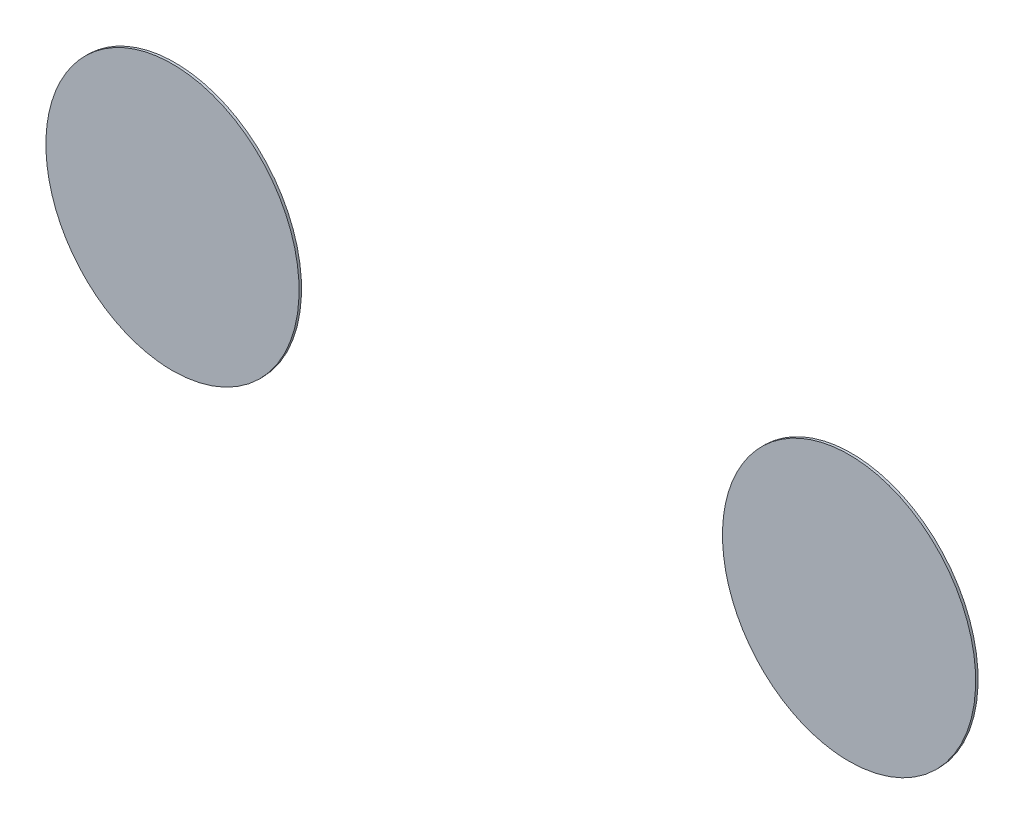
ISO-10303-21;
HEADER;
FILE_DESCRIPTION(('STEP AP214'),'2;1');
FILE_NAME('part.step','',(''),(''),'','','');
FILE_SCHEMA(('AUTOMOTIVE_DESIGN { 1 0 10303 214 1 1 1 1 }'));
ENDSEC;
DATA;
#1=APPLICATION_CONTEXT('core data for automotive mechanical design processes');
#2=APPLICATION_PROTOCOL_DEFINITION('international standard','automotive_design',2000,#1);
#3=PRODUCT_CONTEXT('',#1,'mechanical');
#4=PRODUCT('Part','Part','',(#3));
#5=PRODUCT_RELATED_PRODUCT_CATEGORY('part','',(#4));
#6=PRODUCT_DEFINITION_FORMATION('','',#4);
#7=PRODUCT_DEFINITION_CONTEXT('part definition',#1,'design');
#8=PRODUCT_DEFINITION('design','',#6,#7);
#9=PRODUCT_DEFINITION_SHAPE('','',#8);
#10=(LENGTH_UNIT() NAMED_UNIT(*) SI_UNIT(.MILLI.,.METRE.));
#11=(NAMED_UNIT(*) PLANE_ANGLE_UNIT() SI_UNIT($,.RADIAN.));
#12=(NAMED_UNIT(*) SI_UNIT($,.STERADIAN.) SOLID_ANGLE_UNIT());
#13=UNCERTAINTY_MEASURE_WITH_UNIT(LENGTH_MEASURE(1.E-05),#10,'distance_accuracy_value','');
#14=(GEOMETRIC_REPRESENTATION_CONTEXT(3) GLOBAL_UNCERTAINTY_ASSIGNED_CONTEXT((#13)) GLOBAL_UNIT_ASSIGNED_CONTEXT((#10,
#11,#12)) REPRESENTATION_CONTEXT('',''));
#15=CARTESIAN_POINT('',(0.,0.,0.));
#16=DIRECTION('',(0.,0.,1.));
#17=DIRECTION('',(1.,0.,0.));
#18=AXIS2_PLACEMENT_3D('',#15,#16,#17);
#19=CARTESIAN_POINT('',(27.7774482326432,131.984792082023,0.2));
#20=DIRECTION('',(0.,0.,1.));
#21=DIRECTION('',(0.,-1.,0.));
#22=AXIS2_PLACEMENT_3D('',#19,#20,#21);
#23=ELLIPSE('',#22,10.9064827416671,10.3952413631364);
#24=DIRECTION('',(0.,0.,-1.));
#25=VECTOR('',#24,1.);
#26=SURFACE_OF_LINEAR_EXTRUSION('',#23,#25);
#27=CARTESIAN_POINT('',(27.7774482326432,121.078309340356,0.2));
#28=VERTEX_POINT('',#27);
#29=EDGE_CURVE('E11',#28,#28,#23,.T.);
#30=ORIENTED_EDGE('',*,*,#29,.F.);
#31=EDGE_LOOP('',(#30));
#32=FACE_BOUND('',#31,.T.);
#33=CARTESIAN_POINT('',(27.7774482326432,131.984792082023,0.));
#34=DIRECTION('',(0.,0.,1.));
#35=DIRECTION('',(0.,-1.,0.));
#36=AXIS2_PLACEMENT_3D('',#33,#34,#35);
#37=ELLIPSE('',#36,10.9064827416671,10.3952413631364);
#38=CARTESIAN_POINT('',(27.7774482326432,121.078309340356,0.));
#39=VERTEX_POINT('',#38);
#40=EDGE_CURVE('E43',#39,#39,#37,.T.);
#41=ORIENTED_EDGE('',*,*,#40,.T.);
#42=EDGE_LOOP('',(#41));
#43=FACE_BOUND('',#42,.T.);
#44=ADVANCED_FACE('F39',(#32,#43),#26,.F.);
#45=CARTESIAN_POINT('',(27.7774482326432,131.984792082023,0.2));
#46=DIRECTION('',(0.,0.,1.));
#47=DIRECTION('',(1.,0.,0.));
#48=AXIS2_PLACEMENT_3D('',#45,#46,#47);
#49=PLANE('',#48);
#50=ORIENTED_EDGE('',*,*,#29,.T.);
#51=EDGE_LOOP('',(#50));
#52=FACE_BOUND('',#51,.T.);
#53=ADVANCED_FACE('F55',(#52),#49,.T.);
#54=CARTESIAN_POINT('',(27.7774482326432,131.984792082023,0.));
#55=DIRECTION('',(0.,0.,1.));
#56=DIRECTION('',(1.,0.,0.));
#57=AXIS2_PLACEMENT_3D('',#54,#55,#56);
#58=PLANE('',#57);
#59=ORIENTED_EDGE('',*,*,#40,.F.);
#60=EDGE_LOOP('',(#59));
#61=FACE_BOUND('',#60,.T.);
#62=ADVANCED_FACE('F53',(#61),#58,.F.);
#63=CLOSED_SHELL('',(#44,#53,#62));
#64=MANIFOLD_SOLID_BREP('B2',#63);
#65=CARTESIAN_POINT('',(-27.7774482326432,131.984792082023,0.2));
#66=DIRECTION('',(0.,0.,1.));
#67=DIRECTION('',(0.,-1.,0.));
#68=AXIS2_PLACEMENT_3D('',#65,#66,#67);
#69=ELLIPSE('',#68,10.9064827416671,10.3952413631364);
#70=DIRECTION('',(0.,0.,-1.));
#71=VECTOR('',#70,1.);
#72=SURFACE_OF_LINEAR_EXTRUSION('',#69,#71);
#73=CARTESIAN_POINT('',(-27.7774482326432,121.078309340356,0.2));
#74=VERTEX_POINT('',#73);
#75=EDGE_CURVE('E38',#74,#74,#69,.T.);
#76=ORIENTED_EDGE('',*,*,#75,.F.);
#77=EDGE_LOOP('',(#76));
#78=FACE_BOUND('',#77,.T.);
#79=CARTESIAN_POINT('',(-27.7774482326432,131.984792082023,0.));
#80=DIRECTION('',(0.,0.,1.));
#81=DIRECTION('',(0.,-1.,0.));
#82=AXIS2_PLACEMENT_3D('',#79,#80,#81);
#83=ELLIPSE('',#82,10.9064827416671,10.3952413631364);
#84=CARTESIAN_POINT('',(-27.7774482326432,121.078309340356,0.));
#85=VERTEX_POINT('',#84);
#86=EDGE_CURVE('E85',#85,#85,#83,.T.);
#87=ORIENTED_EDGE('',*,*,#86,.T.);
#88=EDGE_LOOP('',(#87));
#89=FACE_BOUND('',#88,.T.);
#90=ADVANCED_FACE('F81',(#78,#89),#72,.F.);
#91=CARTESIAN_POINT('',(-27.7774482326432,131.984792082023,0.2));
#92=DIRECTION('',(0.,0.,1.));
#93=DIRECTION('',(1.,0.,0.));
#94=AXIS2_PLACEMENT_3D('',#91,#92,#93);
#95=PLANE('',#94);
#96=ORIENTED_EDGE('',*,*,#75,.T.);
#97=EDGE_LOOP('',(#96));
#98=FACE_BOUND('',#97,.T.);
#99=ADVANCED_FACE('F97',(#98),#95,.T.);
#100=CARTESIAN_POINT('',(-27.7774482326432,131.984792082023,0.));
#101=DIRECTION('',(0.,0.,1.));
#102=DIRECTION('',(1.,0.,0.));
#103=AXIS2_PLACEMENT_3D('',#100,#101,#102);
#104=PLANE('',#103);
#105=ORIENTED_EDGE('',*,*,#86,.F.);
#106=EDGE_LOOP('',(#105));
#107=FACE_BOUND('',#106,.T.);
#108=ADVANCED_FACE('F95',(#107),#104,.F.);
#109=CLOSED_SHELL('',(#90,#99,#108));
#110=MANIFOLD_SOLID_BREP('B6',#109);
#111=ADVANCED_BREP_SHAPE_REPRESENTATION('',(#18,#64,#110),#14);
#112=SHAPE_DEFINITION_REPRESENTATION(#9,#111);
ENDSEC;
END-ISO-10303-21;
